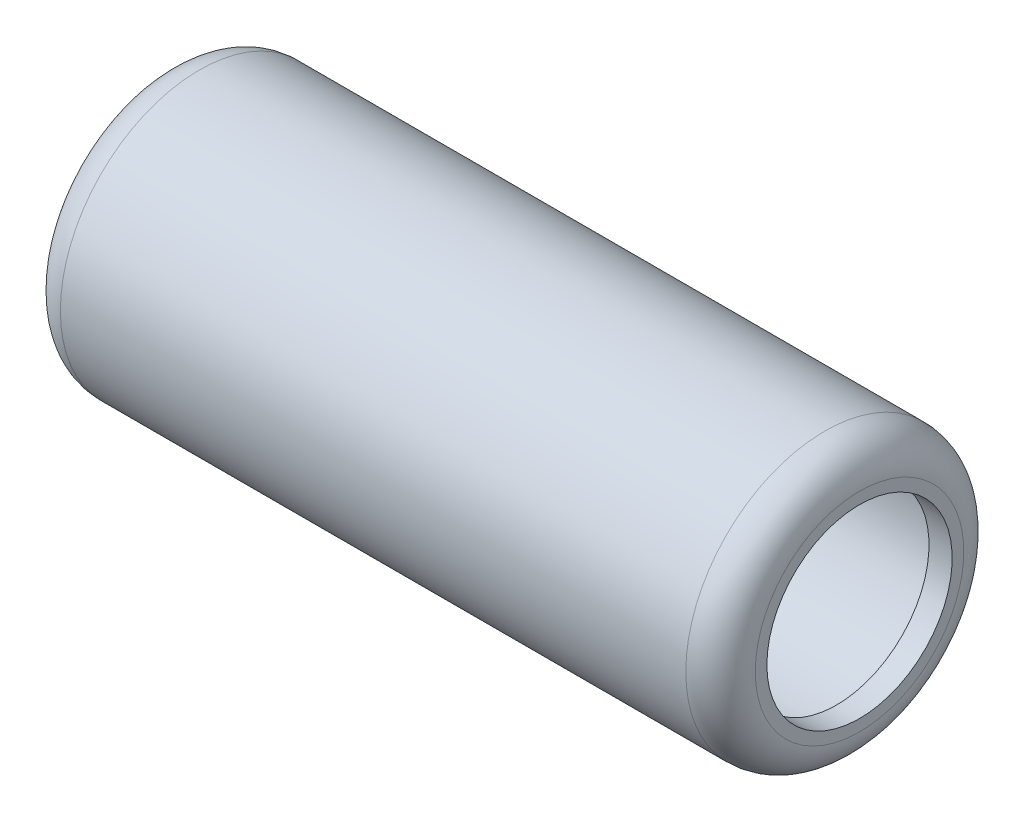
ISO-10303-21;
HEADER;
FILE_DESCRIPTION(('STEP AP214'),'2;1');
FILE_NAME('part.step','',(''),(''),'','','');
FILE_SCHEMA(('AUTOMOTIVE_DESIGN { 1 0 10303 214 1 1 1 1 }'));
ENDSEC;
DATA;
#1=APPLICATION_CONTEXT('core data for automotive mechanical design processes');
#2=APPLICATION_PROTOCOL_DEFINITION('international standard','automotive_design',2000,#1);
#3=PRODUCT_CONTEXT('',#1,'mechanical');
#4=PRODUCT('Part','Part','',(#3));
#5=PRODUCT_RELATED_PRODUCT_CATEGORY('part','',(#4));
#6=PRODUCT_DEFINITION_FORMATION('','',#4);
#7=PRODUCT_DEFINITION_CONTEXT('part definition',#1,'design');
#8=PRODUCT_DEFINITION('design','',#6,#7);
#9=PRODUCT_DEFINITION_SHAPE('','',#8);
#10=(LENGTH_UNIT() NAMED_UNIT(*) SI_UNIT(.MILLI.,.METRE.));
#11=(NAMED_UNIT(*) PLANE_ANGLE_UNIT() SI_UNIT($,.RADIAN.));
#12=(NAMED_UNIT(*) SI_UNIT($,.STERADIAN.) SOLID_ANGLE_UNIT());
#13=UNCERTAINTY_MEASURE_WITH_UNIT(LENGTH_MEASURE(1.E-05),#10,'distance_accuracy_value','');
#14=(GEOMETRIC_REPRESENTATION_CONTEXT(3) GLOBAL_UNCERTAINTY_ASSIGNED_CONTEXT((#13)) GLOBAL_UNIT_ASSIGNED_CONTEXT((#10,
#11,#12)) REPRESENTATION_CONTEXT('',''));
#15=CARTESIAN_POINT('',(0.,0.,0.));
#16=DIRECTION('',(0.,0.,1.));
#17=DIRECTION('',(1.,0.,0.));
#18=AXIS2_PLACEMENT_3D('',#15,#16,#17);
#19=CARTESIAN_POINT('',(1.5,0.,0.));
#20=DIRECTION('',(-1.,0.,0.));
#21=DIRECTION('',(0.,0.,1.));
#22=AXIS2_PLACEMENT_3D('',#19,#20,#21);
#23=TOROIDAL_SURFACE('',#22,4.5,1.5);
#24=CARTESIAN_POINT('',(0.,0.,0.));
#25=DIRECTION('',(-1.,0.,0.));
#26=DIRECTION('',(0.,0.,1.));
#27=AXIS2_PLACEMENT_3D('',#24,#25,#26);
#28=CIRCLE('',#27,4.5);
#29=CARTESIAN_POINT('',(0.,0.,4.5));
#30=VERTEX_POINT('',#29);
#31=EDGE_CURVE('E10',#30,#30,#28,.T.);
#32=ORIENTED_EDGE('',*,*,#31,.F.);
#33=EDGE_LOOP('',(#32));
#34=FACE_BOUND('',#33,.T.);
#35=CARTESIAN_POINT('',(1.5,0.,0.));
#36=DIRECTION('',(-1.,0.,0.));
#37=DIRECTION('',(0.,0.,1.));
#38=AXIS2_PLACEMENT_3D('',#35,#36,#37);
#39=CIRCLE('',#38,6.);
#40=CARTESIAN_POINT('',(1.5,0.,6.));
#41=VERTEX_POINT('',#40);
#42=EDGE_CURVE('E73',#41,#41,#39,.T.);
#43=ORIENTED_EDGE('',*,*,#42,.T.);
#44=EDGE_LOOP('',(#43));
#45=FACE_BOUND('',#44,.T.);
#46=ADVANCED_FACE('F33',(#34,#45),#23,.T.);
#47=CARTESIAN_POINT('',(0.,4.5,0.));
#48=DIRECTION('',(1.,0.,0.));
#49=DIRECTION('',(0.,0.,-1.));
#50=AXIS2_PLACEMENT_3D('',#47,#48,#49);
#51=PLANE('',#50);
#52=CARTESIAN_POINT('',(0.,0.,0.));
#53=DIRECTION('',(-1.,0.,0.));
#54=DIRECTION('',(0.,0.,1.));
#55=AXIS2_PLACEMENT_3D('',#52,#53,#54);
#56=CIRCLE('',#55,4.);
#57=CARTESIAN_POINT('',(0.,0.,4.));
#58=VERTEX_POINT('',#57);
#59=EDGE_CURVE('E39',#58,#58,#56,.T.);
#60=ORIENTED_EDGE('',*,*,#59,.F.);
#61=EDGE_LOOP('',(#60));
#62=FACE_BOUND('',#61,.T.);
#63=ORIENTED_EDGE('',*,*,#31,.T.);
#64=EDGE_LOOP('',(#63));
#65=FACE_BOUND('',#64,.T.);
#66=ADVANCED_FACE('F134',(#62,#65),#51,.F.);
#67=CARTESIAN_POINT('',(0.,0.,0.));
#68=DIRECTION('',(-1.,0.,0.));
#69=DIRECTION('',(0.,0.,1.));
#70=AXIS2_PLACEMENT_3D('',#67,#68,#69);
#71=CYLINDRICAL_SURFACE('',#70,4.);
#72=CARTESIAN_POINT('',(1.,0.,0.));
#73=DIRECTION('',(-1.,0.,0.));
#74=DIRECTION('',(0.,0.,1.));
#75=AXIS2_PLACEMENT_3D('',#72,#73,#74);
#76=CIRCLE('',#75,4.);
#77=CARTESIAN_POINT('',(1.,0.,4.));
#78=VERTEX_POINT('',#77);
#79=EDGE_CURVE('E43',#78,#78,#76,.T.);
#80=ORIENTED_EDGE('',*,*,#79,.F.);
#81=EDGE_LOOP('',(#80));
#82=FACE_BOUND('',#81,.T.);
#83=ORIENTED_EDGE('',*,*,#59,.T.);
#84=EDGE_LOOP('',(#83));
#85=FACE_BOUND('',#84,.T.);
#86=ADVANCED_FACE('F129',(#82,#85),#71,.F.);
#87=CARTESIAN_POINT('',(1.,4.,0.));
#88=DIRECTION('',(-1.,0.,0.));
#89=DIRECTION('',(0.,0.,1.));
#90=AXIS2_PLACEMENT_3D('',#87,#88,#89);
#91=PLANE('',#90);
#92=CARTESIAN_POINT('',(1.,0.,0.));
#93=DIRECTION('',(-1.,0.,0.));
#94=DIRECTION('',(0.,0.,1.));
#95=AXIS2_PLACEMENT_3D('',#92,#93,#94);
#96=CIRCLE('',#95,4.5);
#97=CARTESIAN_POINT('',(1.,0.,4.5));
#98=VERTEX_POINT('',#97);
#99=EDGE_CURVE('E47',#98,#98,#96,.T.);
#100=ORIENTED_EDGE('',*,*,#99,.F.);
#101=EDGE_LOOP('',(#100));
#102=FACE_BOUND('',#101,.T.);
#103=ORIENTED_EDGE('',*,*,#79,.T.);
#104=EDGE_LOOP('',(#103));
#105=FACE_BOUND('',#104,.T.);
#106=ADVANCED_FACE('F123',(#102,#105),#91,.F.);
#107=CARTESIAN_POINT('',(1.5,0.,0.));
#108=DIRECTION('',(-1.,0.,0.));
#109=DIRECTION('',(0.,0.,1.));
#110=AXIS2_PLACEMENT_3D('',#107,#108,#109);
#111=TOROIDAL_SURFACE('',#110,4.5,0.5);
#112=CARTESIAN_POINT('',(1.5,0.,0.));
#113=DIRECTION('',(-1.,0.,0.));
#114=DIRECTION('',(0.,0.,1.));
#115=AXIS2_PLACEMENT_3D('',#112,#113,#114);
#116=CIRCLE('',#115,5.);
#117=CARTESIAN_POINT('',(1.5,0.,5.));
#118=VERTEX_POINT('',#117);
#119=EDGE_CURVE('E52',#118,#118,#116,.T.);
#120=ORIENTED_EDGE('',*,*,#119,.F.);
#121=EDGE_LOOP('',(#120));
#122=FACE_BOUND('',#121,.T.);
#123=ORIENTED_EDGE('',*,*,#99,.T.);
#124=EDGE_LOOP('',(#123));
#125=FACE_BOUND('',#124,.T.);
#126=ADVANCED_FACE('F117',(#122,#125),#111,.F.);
#127=CARTESIAN_POINT('',(0.,0.,0.));
#128=DIRECTION('',(-1.,0.,0.));
#129=DIRECTION('',(0.,0.,1.));
#130=AXIS2_PLACEMENT_3D('',#127,#128,#129);
#131=CYLINDRICAL_SURFACE('',#130,5.);
#132=CARTESIAN_POINT('',(28.5,0.,0.));
#133=DIRECTION('',(-1.,0.,0.));
#134=DIRECTION('',(0.,0.,1.));
#135=AXIS2_PLACEMENT_3D('',#132,#133,#134);
#136=CIRCLE('',#135,5.);
#137=CARTESIAN_POINT('',(28.5,0.,5.));
#138=VERTEX_POINT('',#137);
#139=EDGE_CURVE('E55',#138,#138,#136,.T.);
#140=ORIENTED_EDGE('',*,*,#139,.F.);
#141=EDGE_LOOP('',(#140));
#142=FACE_BOUND('',#141,.T.);
#143=ORIENTED_EDGE('',*,*,#119,.T.);
#144=EDGE_LOOP('',(#143));
#145=FACE_BOUND('',#144,.T.);
#146=ADVANCED_FACE('F111',(#142,#145),#131,.F.);
#147=CARTESIAN_POINT('',(28.5,0.,0.));
#148=DIRECTION('',(-1.,0.,0.));
#149=DIRECTION('',(0.,0.,1.));
#150=AXIS2_PLACEMENT_3D('',#147,#148,#149);
#151=TOROIDAL_SURFACE('',#150,4.5,0.500000000000001);
#152=CARTESIAN_POINT('',(29.,0.,0.));
#153=DIRECTION('',(-1.,0.,0.));
#154=DIRECTION('',(0.,0.,1.));
#155=AXIS2_PLACEMENT_3D('',#152,#153,#154);
#156=CIRCLE('',#155,4.5);
#157=CARTESIAN_POINT('',(29.,0.,4.5));
#158=VERTEX_POINT('',#157);
#159=EDGE_CURVE('E58',#158,#158,#156,.T.);
#160=ORIENTED_EDGE('',*,*,#159,.F.);
#161=EDGE_LOOP('',(#160));
#162=FACE_BOUND('',#161,.T.);
#163=ORIENTED_EDGE('',*,*,#139,.T.);
#164=EDGE_LOOP('',(#163));
#165=FACE_BOUND('',#164,.T.);
#166=ADVANCED_FACE('F105',(#162,#165),#151,.F.);
#167=CARTESIAN_POINT('',(29.,4.5,0.));
#168=DIRECTION('',(1.,0.,0.));
#169=DIRECTION('',(0.,0.,-1.));
#170=AXIS2_PLACEMENT_3D('',#167,#168,#169);
#171=PLANE('',#170);
#172=CARTESIAN_POINT('',(29.,0.,0.));
#173=DIRECTION('',(-1.,0.,0.));
#174=DIRECTION('',(0.,0.,1.));
#175=AXIS2_PLACEMENT_3D('',#172,#173,#174);
#176=CIRCLE('',#175,3.99999999999999);
#177=CARTESIAN_POINT('',(29.,0.,3.99999999999999));
#178=VERTEX_POINT('',#177);
#179=EDGE_CURVE('E61',#178,#178,#176,.T.);
#180=ORIENTED_EDGE('',*,*,#179,.F.);
#181=EDGE_LOOP('',(#180));
#182=FACE_BOUND('',#181,.T.);
#183=ORIENTED_EDGE('',*,*,#159,.T.);
#184=EDGE_LOOP('',(#183));
#185=FACE_BOUND('',#184,.T.);
#186=ADVANCED_FACE('F99',(#182,#185),#171,.F.);
#187=CARTESIAN_POINT('',(0.,0.,0.));
#188=DIRECTION('',(-1.,0.,0.));
#189=DIRECTION('',(0.,0.,1.));
#190=AXIS2_PLACEMENT_3D('',#187,#188,#189);
#191=CYLINDRICAL_SURFACE('',#190,3.99999999999999);
#192=CARTESIAN_POINT('',(30.,0.,0.));
#193=DIRECTION('',(-1.,0.,0.));
#194=DIRECTION('',(0.,0.,1.));
#195=AXIS2_PLACEMENT_3D('',#192,#193,#194);
#196=CIRCLE('',#195,3.99999999999999);
#197=CARTESIAN_POINT('',(30.,0.,3.99999999999999));
#198=VERTEX_POINT('',#197);
#199=EDGE_CURVE('E64',#198,#198,#196,.T.);
#200=ORIENTED_EDGE('',*,*,#199,.F.);
#201=EDGE_LOOP('',(#200));
#202=FACE_BOUND('',#201,.T.);
#203=ORIENTED_EDGE('',*,*,#179,.T.);
#204=EDGE_LOOP('',(#203));
#205=FACE_BOUND('',#204,.T.);
#206=ADVANCED_FACE('F93',(#202,#205),#191,.F.);
#207=CARTESIAN_POINT('',(30.,3.99999999999999,0.));
#208=DIRECTION('',(-1.,0.,0.));
#209=DIRECTION('',(0.,0.,1.));
#210=AXIS2_PLACEMENT_3D('',#207,#208,#209);
#211=PLANE('',#210);
#212=CARTESIAN_POINT('',(30.,0.,0.));
#213=DIRECTION('',(-1.,0.,0.));
#214=DIRECTION('',(0.,0.,1.));
#215=AXIS2_PLACEMENT_3D('',#212,#213,#214);
#216=CIRCLE('',#215,4.49999999999999);
#217=CARTESIAN_POINT('',(30.,0.,4.49999999999999));
#218=VERTEX_POINT('',#217);
#219=EDGE_CURVE('E67',#218,#218,#216,.T.);
#220=ORIENTED_EDGE('',*,*,#219,.F.);
#221=EDGE_LOOP('',(#220));
#222=FACE_BOUND('',#221,.T.);
#223=ORIENTED_EDGE('',*,*,#199,.T.);
#224=EDGE_LOOP('',(#223));
#225=FACE_BOUND('',#224,.T.);
#226=ADVANCED_FACE('F87',(#222,#225),#211,.F.);
#227=CARTESIAN_POINT('',(28.5,0.,0.));
#228=DIRECTION('',(-1.,0.,0.));
#229=DIRECTION('',(0.,0.,1.));
#230=AXIS2_PLACEMENT_3D('',#227,#228,#229);
#231=TOROIDAL_SURFACE('',#230,4.5,1.5);
#232=CARTESIAN_POINT('',(28.5,0.,0.));
#233=DIRECTION('',(-1.,0.,0.));
#234=DIRECTION('',(0.,0.,1.));
#235=AXIS2_PLACEMENT_3D('',#232,#233,#234);
#236=CIRCLE('',#235,5.99999999999999);
#237=CARTESIAN_POINT('',(28.5,0.,5.99999999999999));
#238=VERTEX_POINT('',#237);
#239=EDGE_CURVE('E70',#238,#238,#236,.T.);
#240=ORIENTED_EDGE('',*,*,#239,.F.);
#241=EDGE_LOOP('',(#240));
#242=FACE_BOUND('',#241,.T.);
#243=ORIENTED_EDGE('',*,*,#219,.T.);
#244=EDGE_LOOP('',(#243));
#245=FACE_BOUND('',#244,.T.);
#246=ADVANCED_FACE('F81',(#242,#245),#231,.T.);
#247=CARTESIAN_POINT('',(0.,0.,0.));
#248=DIRECTION('',(-1.,0.,0.));
#249=DIRECTION('',(0.,0.,1.));
#250=AXIS2_PLACEMENT_3D('',#247,#248,#249);
#251=CYLINDRICAL_SURFACE('',#250,6.);
#252=ORIENTED_EDGE('',*,*,#42,.F.);
#253=EDGE_LOOP('',(#252));
#254=FACE_BOUND('',#253,.T.);
#255=ORIENTED_EDGE('',*,*,#239,.T.);
#256=EDGE_LOOP('',(#255));
#257=FACE_BOUND('',#256,.T.);
#258=ADVANCED_FACE('F78',(#254,#257),#251,.T.);
#259=CLOSED_SHELL('',(#46,#66,#86,#106,#126,#146,#166,#186,#206,#226,#246,#258));
#260=MANIFOLD_SOLID_BREP('B2',#259);
#261=ADVANCED_BREP_SHAPE_REPRESENTATION('',(#18,#260),#14);
#262=SHAPE_DEFINITION_REPRESENTATION(#9,#261);
ENDSEC;
END-ISO-10303-21;
